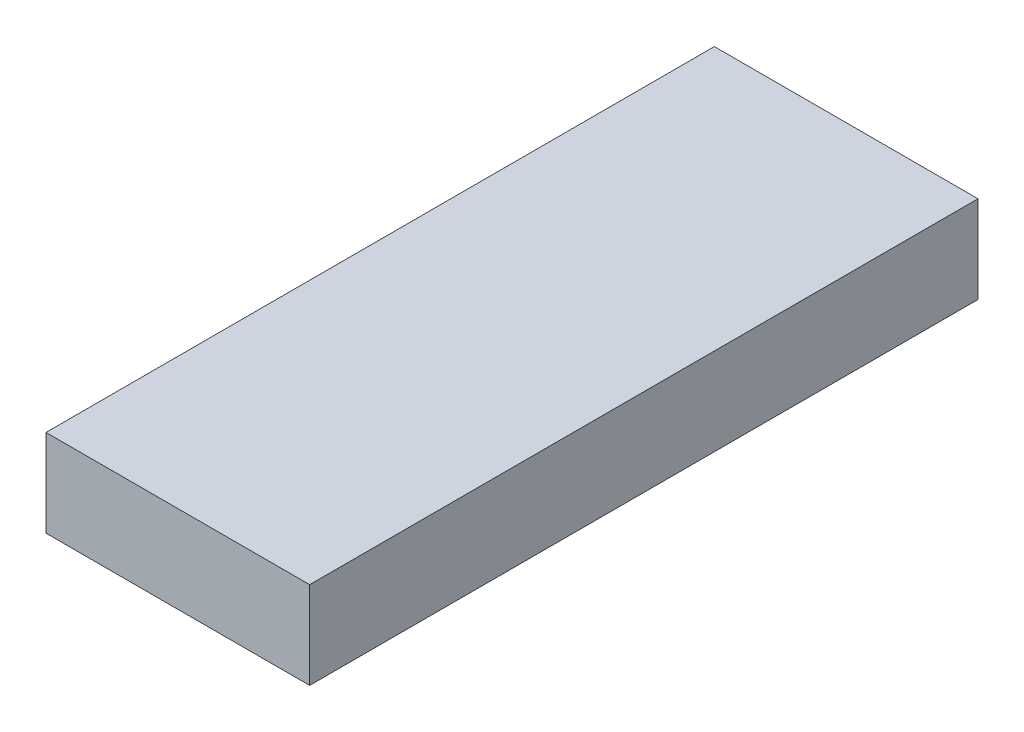
ISO-10303-21;
HEADER;
FILE_DESCRIPTION(('STEP AP214'),'2;1');
FILE_NAME('part.step','',(''),(''),'','','');
FILE_SCHEMA(('AUTOMOTIVE_DESIGN { 1 0 10303 214 1 1 1 1 }'));
ENDSEC;
DATA;
#1=APPLICATION_CONTEXT('core data for automotive mechanical design processes');
#2=APPLICATION_PROTOCOL_DEFINITION('international standard','automotive_design',2000,#1);
#3=PRODUCT_CONTEXT('',#1,'mechanical');
#4=PRODUCT('Part','Part','',(#3));
#5=PRODUCT_RELATED_PRODUCT_CATEGORY('part','',(#4));
#6=PRODUCT_DEFINITION_FORMATION('','',#4);
#7=PRODUCT_DEFINITION_CONTEXT('part definition',#1,'design');
#8=PRODUCT_DEFINITION('design','',#6,#7);
#9=PRODUCT_DEFINITION_SHAPE('','',#8);
#10=(LENGTH_UNIT() NAMED_UNIT(*) SI_UNIT(.MILLI.,.METRE.));
#11=(NAMED_UNIT(*) PLANE_ANGLE_UNIT() SI_UNIT($,.RADIAN.));
#12=(NAMED_UNIT(*) SI_UNIT($,.STERADIAN.) SOLID_ANGLE_UNIT());
#13=UNCERTAINTY_MEASURE_WITH_UNIT(LENGTH_MEASURE(1.E-05),#10,'distance_accuracy_value','');
#14=(GEOMETRIC_REPRESENTATION_CONTEXT(3) GLOBAL_UNCERTAINTY_ASSIGNED_CONTEXT((#13)) GLOBAL_UNIT_ASSIGNED_CONTEXT((#10,
#11,#12)) REPRESENTATION_CONTEXT('',''));
#15=CARTESIAN_POINT('',(0.,0.,0.));
#16=DIRECTION('',(0.,0.,1.));
#17=DIRECTION('',(1.,0.,0.));
#18=AXIS2_PLACEMENT_3D('',#15,#16,#17);
#19=CARTESIAN_POINT('',(9.017,5.969,-22.86));
#20=DIRECTION('',(-1.,0.,0.));
#21=DIRECTION('',(0.,0.,1.));
#22=AXIS2_PLACEMENT_3D('',#19,#20,#21);
#23=PLANE('',#22);
#24=DIRECTION('',(0.,0.,-1.));
#25=VECTOR('',#24,1.);
#26=CARTESIAN_POINT('',(9.017,0.,-22.86));
#27=LINE('',#26,#25);
#28=CARTESIAN_POINT('',(9.017,0.,22.86));
#29=VERTEX_POINT('',#28);
#30=CARTESIAN_POINT('',(9.017,0.,-22.86));
#31=VERTEX_POINT('',#30);
#32=EDGE_CURVE('E96',#29,#31,#27,.T.);
#33=ORIENTED_EDGE('',*,*,#32,.T.);
#34=DIRECTION('',(0.,-1.,0.));
#35=VECTOR('',#34,1.);
#36=CARTESIAN_POINT('',(9.017,5.969,-22.86));
#37=LINE('',#36,#35);
#38=CARTESIAN_POINT('',(9.017,5.969,-22.86));
#39=VERTEX_POINT('',#38);
#40=EDGE_CURVE('E11',#39,#31,#37,.T.);
#41=ORIENTED_EDGE('',*,*,#40,.F.);
#42=DIRECTION('',(0.,0.,-1.));
#43=VECTOR('',#42,1.);
#44=CARTESIAN_POINT('',(9.017,5.969,-22.86));
#45=LINE('',#44,#43);
#46=CARTESIAN_POINT('',(9.017,5.969,22.86));
#47=VERTEX_POINT('',#46);
#48=EDGE_CURVE('E84',#47,#39,#45,.T.);
#49=ORIENTED_EDGE('',*,*,#48,.F.);
#50=DIRECTION('',(0.,-1.,0.));
#51=VECTOR('',#50,1.);
#52=CARTESIAN_POINT('',(9.017,5.969,22.86));
#53=LINE('',#52,#51);
#54=EDGE_CURVE('E92',#47,#29,#53,.T.);
#55=ORIENTED_EDGE('',*,*,#54,.T.);
#56=EDGE_LOOP('',(#33,#41,#49,#55));
#57=FACE_BOUND('',#56,.T.);
#58=ADVANCED_FACE('F33',(#57),#23,.F.);
#59=CARTESIAN_POINT('',(-9.017,5.969,-22.86));
#60=DIRECTION('',(0.,0.,1.));
#61=DIRECTION('',(1.,0.,0.));
#62=AXIS2_PLACEMENT_3D('',#59,#60,#61);
#63=PLANE('',#62);
#64=DIRECTION('',(-1.,0.,0.));
#65=VECTOR('',#64,1.);
#66=CARTESIAN_POINT('',(-9.017,0.,-22.86));
#67=LINE('',#66,#65);
#68=CARTESIAN_POINT('',(-9.017,0.,-22.86));
#69=VERTEX_POINT('',#68);
#70=EDGE_CURVE('E88',#31,#69,#67,.T.);
#71=ORIENTED_EDGE('',*,*,#70,.T.);
#72=DIRECTION('',(0.,-1.,0.));
#73=VECTOR('',#72,1.);
#74=CARTESIAN_POINT('',(-9.017,5.969,-22.86));
#75=LINE('',#74,#73);
#76=CARTESIAN_POINT('',(-9.017,5.969,-22.86));
#77=VERTEX_POINT('',#76);
#78=EDGE_CURVE('E41',#77,#69,#75,.T.);
#79=ORIENTED_EDGE('',*,*,#78,.F.);
#80=DIRECTION('',(-1.,0.,0.));
#81=VECTOR('',#80,1.);
#82=CARTESIAN_POINT('',(-9.017,5.969,-22.86));
#83=LINE('',#82,#81);
#84=EDGE_CURVE('E79',#39,#77,#83,.T.);
#85=ORIENTED_EDGE('',*,*,#84,.F.);
#86=ORIENTED_EDGE('',*,*,#40,.T.);
#87=EDGE_LOOP('',(#71,#79,#85,#86));
#88=FACE_BOUND('',#87,.T.);
#89=ADVANCED_FACE('F87',(#88),#63,.F.);
#90=CARTESIAN_POINT('',(-9.017,5.969,-22.86));
#91=DIRECTION('',(1.,0.,0.));
#92=DIRECTION('',(0.,0.,-1.));
#93=AXIS2_PLACEMENT_3D('',#90,#91,#92);
#94=PLANE('',#93);
#95=DIRECTION('',(0.,0.,1.));
#96=VECTOR('',#95,1.);
#97=CARTESIAN_POINT('',(-9.017,0.,-22.86));
#98=LINE('',#97,#96);
#99=CARTESIAN_POINT('',(-9.017,0.,22.86));
#100=VERTEX_POINT('',#99);
#101=EDGE_CURVE('E66',#69,#100,#98,.T.);
#102=ORIENTED_EDGE('',*,*,#101,.T.);
#103=DIRECTION('',(0.,-1.,0.));
#104=VECTOR('',#103,1.);
#105=CARTESIAN_POINT('',(-9.017,5.969,22.86));
#106=LINE('',#105,#104);
#107=CARTESIAN_POINT('',(-9.017,5.969,22.86));
#108=VERTEX_POINT('',#107);
#109=EDGE_CURVE('E89',#108,#100,#106,.T.);
#110=ORIENTED_EDGE('',*,*,#109,.F.);
#111=DIRECTION('',(0.,0.,1.));
#112=VECTOR('',#111,1.);
#113=CARTESIAN_POINT('',(-9.017,5.969,-22.86));
#114=LINE('',#113,#112);
#115=EDGE_CURVE('E82',#77,#108,#114,.T.);
#116=ORIENTED_EDGE('',*,*,#115,.F.);
#117=ORIENTED_EDGE('',*,*,#78,.T.);
#118=EDGE_LOOP('',(#102,#110,#116,#117));
#119=FACE_BOUND('',#118,.T.);
#120=ADVANCED_FACE('F90',(#119),#94,.F.);
#121=CARTESIAN_POINT('',(-9.017,5.969,22.86));
#122=DIRECTION('',(0.,0.,-1.));
#123=DIRECTION('',(-1.,0.,0.));
#124=AXIS2_PLACEMENT_3D('',#121,#122,#123);
#125=PLANE('',#124);
#126=DIRECTION('',(1.,0.,0.));
#127=VECTOR('',#126,1.);
#128=CARTESIAN_POINT('',(-9.017,0.,22.86));
#129=LINE('',#128,#127);
#130=EDGE_CURVE('E72',#100,#29,#129,.T.);
#131=ORIENTED_EDGE('',*,*,#130,.T.);
#132=ORIENTED_EDGE('',*,*,#54,.F.);
#133=DIRECTION('',(1.,0.,0.));
#134=VECTOR('',#133,1.);
#135=CARTESIAN_POINT('',(-9.017,5.969,22.86));
#136=LINE('',#135,#134);
#137=EDGE_CURVE('E49',#108,#47,#136,.T.);
#138=ORIENTED_EDGE('',*,*,#137,.F.);
#139=ORIENTED_EDGE('',*,*,#109,.T.);
#140=EDGE_LOOP('',(#131,#132,#138,#139));
#141=FACE_BOUND('',#140,.T.);
#142=ADVANCED_FACE('F103',(#141),#125,.F.);
#143=CARTESIAN_POINT('',(0.,5.969,0.));
#144=DIRECTION('',(0.,1.,0.));
#145=DIRECTION('',(0.,0.,1.));
#146=AXIS2_PLACEMENT_3D('',#143,#144,#145);
#147=PLANE('',#146);
#148=ORIENTED_EDGE('',*,*,#48,.T.);
#149=ORIENTED_EDGE('',*,*,#84,.T.);
#150=ORIENTED_EDGE('',*,*,#115,.T.);
#151=ORIENTED_EDGE('',*,*,#137,.T.);
#152=EDGE_LOOP('',(#148,#149,#150,#151));
#153=FACE_BOUND('',#152,.T.);
#154=ADVANCED_FACE('F80',(#153),#147,.T.);
#155=CARTESIAN_POINT('',(0.,0.,0.));
#156=DIRECTION('',(0.,1.,0.));
#157=DIRECTION('',(0.,0.,1.));
#158=AXIS2_PLACEMENT_3D('',#155,#156,#157);
#159=PLANE('',#158);
#160=ORIENTED_EDGE('',*,*,#32,.F.);
#161=ORIENTED_EDGE('',*,*,#130,.F.);
#162=ORIENTED_EDGE('',*,*,#101,.F.);
#163=ORIENTED_EDGE('',*,*,#70,.F.);
#164=EDGE_LOOP('',(#160,#161,#162,#163));
#165=FACE_BOUND('',#164,.T.);
#166=ADVANCED_FACE('F106',(#165),#159,.F.);
#167=CLOSED_SHELL('',(#58,#89,#120,#142,#154,#166));
#168=MANIFOLD_SOLID_BREP('B2',#167);
#169=ADVANCED_BREP_SHAPE_REPRESENTATION('',(#18,#168),#14);
#170=SHAPE_DEFINITION_REPRESENTATION(#9,#169);
ENDSEC;
END-ISO-10303-21;
